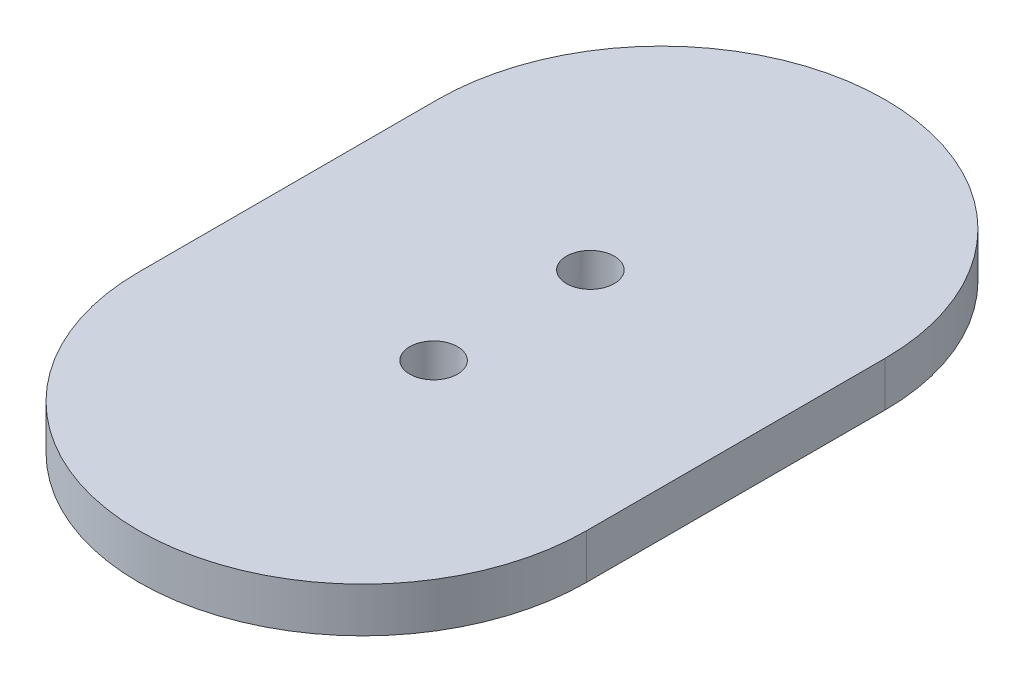
ISO-10303-21;
HEADER;
FILE_DESCRIPTION(('STEP AP214'),'2;1');
FILE_NAME('part.step','',(''),(''),'','','');
FILE_SCHEMA(('AUTOMOTIVE_DESIGN { 1 0 10303 214 1 1 1 1 }'));
ENDSEC;
DATA;
#1=APPLICATION_CONTEXT('core data for automotive mechanical design processes');
#2=APPLICATION_PROTOCOL_DEFINITION('international standard','automotive_design',2000,#1);
#3=PRODUCT_CONTEXT('',#1,'mechanical');
#4=PRODUCT('Part','Part','',(#3));
#5=PRODUCT_RELATED_PRODUCT_CATEGORY('part','',(#4));
#6=PRODUCT_DEFINITION_FORMATION('','',#4);
#7=PRODUCT_DEFINITION_CONTEXT('part definition',#1,'design');
#8=PRODUCT_DEFINITION('design','',#6,#7);
#9=PRODUCT_DEFINITION_SHAPE('','',#8);
#10=(LENGTH_UNIT() NAMED_UNIT(*) SI_UNIT(.MILLI.,.METRE.));
#11=(NAMED_UNIT(*) PLANE_ANGLE_UNIT() SI_UNIT($,.RADIAN.));
#12=(NAMED_UNIT(*) SI_UNIT($,.STERADIAN.) SOLID_ANGLE_UNIT());
#13=UNCERTAINTY_MEASURE_WITH_UNIT(LENGTH_MEASURE(1.E-05),#10,'distance_accuracy_value','');
#14=(GEOMETRIC_REPRESENTATION_CONTEXT(3) GLOBAL_UNCERTAINTY_ASSIGNED_CONTEXT((#13)) GLOBAL_UNIT_ASSIGNED_CONTEXT((#10,
#11,#12)) REPRESENTATION_CONTEXT('',''));
#15=CARTESIAN_POINT('',(0.,0.,0.));
#16=DIRECTION('',(0.,0.,1.));
#17=DIRECTION('',(1.,0.,0.));
#18=AXIS2_PLACEMENT_3D('',#15,#16,#17);
#19=CARTESIAN_POINT('',(0.,3.,0.));
#20=DIRECTION('',(0.,-1.,0.));
#21=DIRECTION('',(0.,0.,-1.));
#22=AXIS2_PLACEMENT_3D('',#19,#20,#21);
#23=CYLINDRICAL_SURFACE('',#22,15.);
#24=CARTESIAN_POINT('',(0.,0.,0.));
#25=DIRECTION('',(0.,1.,0.));
#26=DIRECTION('',(0.,0.,-1.));
#27=AXIS2_PLACEMENT_3D('',#24,#25,#26);
#28=CIRCLE('',#27,15.);
#29=CARTESIAN_POINT('',(15.,0.,0.));
#30=VERTEX_POINT('',#29);
#31=CARTESIAN_POINT('',(-15.,0.,0.));
#32=VERTEX_POINT('',#31);
#33=EDGE_CURVE('E102',#30,#32,#28,.T.);
#34=ORIENTED_EDGE('',*,*,#33,.T.);
#35=DIRECTION('',(0.,-1.,0.));
#36=VECTOR('',#35,1.);
#37=CARTESIAN_POINT('',(-15.,3.,0.));
#38=LINE('',#37,#36);
#39=CARTESIAN_POINT('',(-15.,3.,0.));
#40=VERTEX_POINT('',#39);
#41=EDGE_CURVE('E11',#40,#32,#38,.T.);
#42=ORIENTED_EDGE('',*,*,#41,.F.);
#43=CARTESIAN_POINT('',(0.,3.,0.));
#44=DIRECTION('',(0.,1.,0.));
#45=DIRECTION('',(0.,0.,-1.));
#46=AXIS2_PLACEMENT_3D('',#43,#44,#45);
#47=CIRCLE('',#46,15.);
#48=CARTESIAN_POINT('',(15.,3.,0.));
#49=VERTEX_POINT('',#48);
#50=EDGE_CURVE('E90',#49,#40,#47,.T.);
#51=ORIENTED_EDGE('',*,*,#50,.F.);
#52=DIRECTION('',(0.,-1.,0.));
#53=VECTOR('',#52,1.);
#54=CARTESIAN_POINT('',(15.,3.,0.));
#55=LINE('',#54,#53);
#56=EDGE_CURVE('E98',#49,#30,#55,.T.);
#57=ORIENTED_EDGE('',*,*,#56,.T.);
#58=EDGE_LOOP('',(#34,#42,#51,#57));
#59=FACE_BOUND('',#58,.T.);
#60=ADVANCED_FACE('F39',(#59),#23,.T.);
#61=CARTESIAN_POINT('',(-15.,3.,0.));
#62=DIRECTION('',(1.,0.,0.));
#63=DIRECTION('',(0.,0.,-1.));
#64=AXIS2_PLACEMENT_3D('',#61,#62,#63);
#65=PLANE('',#64);
#66=DIRECTION('',(0.,0.,1.));
#67=VECTOR('',#66,1.);
#68=CARTESIAN_POINT('',(-15.,0.,0.));
#69=LINE('',#68,#67);
#70=CARTESIAN_POINT('',(-15.,0.,20.));
#71=VERTEX_POINT('',#70);
#72=EDGE_CURVE('E94',#32,#71,#69,.T.);
#73=ORIENTED_EDGE('',*,*,#72,.T.);
#74=DIRECTION('',(0.,-1.,0.));
#75=VECTOR('',#74,1.);
#76=CARTESIAN_POINT('',(-15.,3.,20.));
#77=LINE('',#76,#75);
#78=CARTESIAN_POINT('',(-15.,3.,20.));
#79=VERTEX_POINT('',#78);
#80=EDGE_CURVE('E47',#79,#71,#77,.T.);
#81=ORIENTED_EDGE('',*,*,#80,.F.);
#82=DIRECTION('',(0.,0.,1.));
#83=VECTOR('',#82,1.);
#84=CARTESIAN_POINT('',(-15.,3.,0.));
#85=LINE('',#84,#83);
#86=EDGE_CURVE('E85',#40,#79,#85,.T.);
#87=ORIENTED_EDGE('',*,*,#86,.F.);
#88=ORIENTED_EDGE('',*,*,#41,.T.);
#89=EDGE_LOOP('',(#73,#81,#87,#88));
#90=FACE_BOUND('',#89,.T.);
#91=ADVANCED_FACE('F93',(#90),#65,.F.);
#92=CARTESIAN_POINT('',(0.,3.,20.));
#93=DIRECTION('',(0.,-1.,0.));
#94=DIRECTION('',(0.,0.,-1.));
#95=AXIS2_PLACEMENT_3D('',#92,#93,#94);
#96=CYLINDRICAL_SURFACE('',#95,15.);
#97=CARTESIAN_POINT('',(0.,0.,20.));
#98=DIRECTION('',(0.,1.,0.));
#99=DIRECTION('',(0.,0.,1.));
#100=AXIS2_PLACEMENT_3D('',#97,#98,#99);
#101=CIRCLE('',#100,15.);
#102=CARTESIAN_POINT('',(15.,0.,20.));
#103=VERTEX_POINT('',#102);
#104=EDGE_CURVE('E72',#71,#103,#101,.T.);
#105=ORIENTED_EDGE('',*,*,#104,.T.);
#106=DIRECTION('',(0.,-1.,0.));
#107=VECTOR('',#106,1.);
#108=CARTESIAN_POINT('',(15.,3.,20.));
#109=LINE('',#108,#107);
#110=CARTESIAN_POINT('',(15.,3.,20.));
#111=VERTEX_POINT('',#110);
#112=EDGE_CURVE('E95',#111,#103,#109,.T.);
#113=ORIENTED_EDGE('',*,*,#112,.F.);
#114=CARTESIAN_POINT('',(0.,3.,20.));
#115=DIRECTION('',(0.,1.,0.));
#116=DIRECTION('',(0.,0.,1.));
#117=AXIS2_PLACEMENT_3D('',#114,#115,#116);
#118=CIRCLE('',#117,15.);
#119=EDGE_CURVE('E88',#79,#111,#118,.T.);
#120=ORIENTED_EDGE('',*,*,#119,.F.);
#121=ORIENTED_EDGE('',*,*,#80,.T.);
#122=EDGE_LOOP('',(#105,#113,#120,#121));
#123=FACE_BOUND('',#122,.T.);
#124=ADVANCED_FACE('F96',(#123),#96,.T.);
#125=CARTESIAN_POINT('',(15.,3.,0.));
#126=DIRECTION('',(-1.,0.,0.));
#127=DIRECTION('',(0.,0.,1.));
#128=AXIS2_PLACEMENT_3D('',#125,#126,#127);
#129=PLANE('',#128);
#130=DIRECTION('',(0.,0.,-1.));
#131=VECTOR('',#130,1.);
#132=CARTESIAN_POINT('',(15.,0.,0.));
#133=LINE('',#132,#131);
#134=EDGE_CURVE('E78',#103,#30,#133,.T.);
#135=ORIENTED_EDGE('',*,*,#134,.T.);
#136=ORIENTED_EDGE('',*,*,#56,.F.);
#137=DIRECTION('',(0.,0.,-1.));
#138=VECTOR('',#137,1.);
#139=CARTESIAN_POINT('',(15.,3.,0.));
#140=LINE('',#139,#138);
#141=EDGE_CURVE('E55',#111,#49,#140,.T.);
#142=ORIENTED_EDGE('',*,*,#141,.F.);
#143=ORIENTED_EDGE('',*,*,#112,.T.);
#144=EDGE_LOOP('',(#135,#136,#142,#143));
#145=FACE_BOUND('',#144,.T.);
#146=ADVANCED_FACE('F110',(#145),#129,.F.);
#147=CARTESIAN_POINT('',(0.,3.,0.));
#148=DIRECTION('',(0.,-1.,0.));
#149=DIRECTION('',(0.,0.,-1.));
#150=AXIS2_PLACEMENT_3D('',#147,#148,#149);
#151=PLANE('',#150);
#152=CARTESIAN_POINT('',(0.,3.,4.75));
#153=DIRECTION('',(0.,1.,0.));
#154=DIRECTION('',(0.,0.,1.));
#155=AXIS2_PLACEMENT_3D('',#152,#153,#154);
#156=CIRCLE('',#155,1.6);
#157=CARTESIAN_POINT('',(0.,3.,6.35));
#158=VERTEX_POINT('',#157);
#159=EDGE_CURVE('E119',#158,#158,#156,.T.);
#160=ORIENTED_EDGE('',*,*,#159,.F.);
#161=EDGE_LOOP('',(#160));
#162=FACE_BOUND('',#161,.T.);
#163=CARTESIAN_POINT('',(0.,3.,15.25));
#164=DIRECTION('',(0.,1.,0.));
#165=DIRECTION('',(0.,0.,1.));
#166=AXIS2_PLACEMENT_3D('',#163,#164,#165);
#167=CIRCLE('',#166,1.6);
#168=CARTESIAN_POINT('',(0.,3.,16.85));
#169=VERTEX_POINT('',#168);
#170=EDGE_CURVE('E116',#169,#169,#167,.T.);
#171=ORIENTED_EDGE('',*,*,#170,.F.);
#172=EDGE_LOOP('',(#171));
#173=FACE_BOUND('',#172,.T.);
#174=ORIENTED_EDGE('',*,*,#50,.T.);
#175=ORIENTED_EDGE('',*,*,#86,.T.);
#176=ORIENTED_EDGE('',*,*,#119,.T.);
#177=ORIENTED_EDGE('',*,*,#141,.T.);
#178=EDGE_LOOP('',(#174,#175,#176,#177));
#179=FACE_BOUND('',#178,.T.);
#180=ADVANCED_FACE('F86',(#162,#173,#179),#151,.F.);
#181=CARTESIAN_POINT('',(0.,0.,0.));
#182=DIRECTION('',(0.,-1.,0.));
#183=DIRECTION('',(0.,0.,-1.));
#184=AXIS2_PLACEMENT_3D('',#181,#182,#183);
#185=PLANE('',#184);
#186=CARTESIAN_POINT('',(0.,0.,4.75));
#187=DIRECTION('',(0.,-1.,0.));
#188=DIRECTION('',(0.,0.,-1.));
#189=AXIS2_PLACEMENT_3D('',#186,#187,#188);
#190=CIRCLE('',#189,1.6);
#191=CARTESIAN_POINT('',(0.,0.,3.15));
#192=VERTEX_POINT('',#191);
#193=EDGE_CURVE('E105',#192,#192,#190,.F.);
#194=ORIENTED_EDGE('',*,*,#193,.T.);
#195=EDGE_LOOP('',(#194));
#196=FACE_BOUND('',#195,.T.);
#197=CARTESIAN_POINT('',(0.,0.,15.25));
#198=DIRECTION('',(0.,-1.,0.));
#199=DIRECTION('',(0.,0.,-1.));
#200=AXIS2_PLACEMENT_3D('',#197,#198,#199);
#201=CIRCLE('',#200,1.6);
#202=CARTESIAN_POINT('',(0.,0.,13.65));
#203=VERTEX_POINT('',#202);
#204=EDGE_CURVE('E120',#203,#203,#201,.F.);
#205=ORIENTED_EDGE('',*,*,#204,.T.);
#206=EDGE_LOOP('',(#205));
#207=FACE_BOUND('',#206,.T.);
#208=ORIENTED_EDGE('',*,*,#33,.F.);
#209=ORIENTED_EDGE('',*,*,#134,.F.);
#210=ORIENTED_EDGE('',*,*,#104,.F.);
#211=ORIENTED_EDGE('',*,*,#72,.F.);
#212=EDGE_LOOP('',(#208,#209,#210,#211));
#213=FACE_BOUND('',#212,.T.);
#214=ADVANCED_FACE('F113',(#196,#207,#213),#185,.T.);
#215=CARTESIAN_POINT('',(0.,-4.52548339959391,15.25));
#216=DIRECTION('',(0.,1.,0.));
#217=DIRECTION('',(0.,0.,1.));
#218=AXIS2_PLACEMENT_3D('',#215,#216,#217);
#219=CYLINDRICAL_SURFACE('',#218,1.6);
#220=ORIENTED_EDGE('',*,*,#170,.T.);
#221=EDGE_LOOP('',(#220));
#222=FACE_BOUND('',#221,.T.);
#223=ORIENTED_EDGE('',*,*,#204,.F.);
#224=EDGE_LOOP('',(#223));
#225=FACE_BOUND('',#224,.T.);
#226=ADVANCED_FACE('F136',(#222,#225),#219,.F.);
#227=CARTESIAN_POINT('',(0.,-4.52548339959391,4.75));
#228=DIRECTION('',(0.,1.,0.));
#229=DIRECTION('',(0.,0.,1.));
#230=AXIS2_PLACEMENT_3D('',#227,#228,#229);
#231=CYLINDRICAL_SURFACE('',#230,1.6);
#232=ORIENTED_EDGE('',*,*,#159,.T.);
#233=EDGE_LOOP('',(#232));
#234=FACE_BOUND('',#233,.T.);
#235=ORIENTED_EDGE('',*,*,#193,.F.);
#236=EDGE_LOOP('',(#235));
#237=FACE_BOUND('',#236,.T.);
#238=ADVANCED_FACE('F128',(#234,#237),#231,.F.);
#239=CLOSED_SHELL('',(#60,#91,#124,#146,#180,#214,#226,#238));
#240=MANIFOLD_SOLID_BREP('B2',#239);
#241=ADVANCED_BREP_SHAPE_REPRESENTATION('',(#18,#240),#14);
#242=SHAPE_DEFINITION_REPRESENTATION(#9,#241);
ENDSEC;
END-ISO-10303-21;
